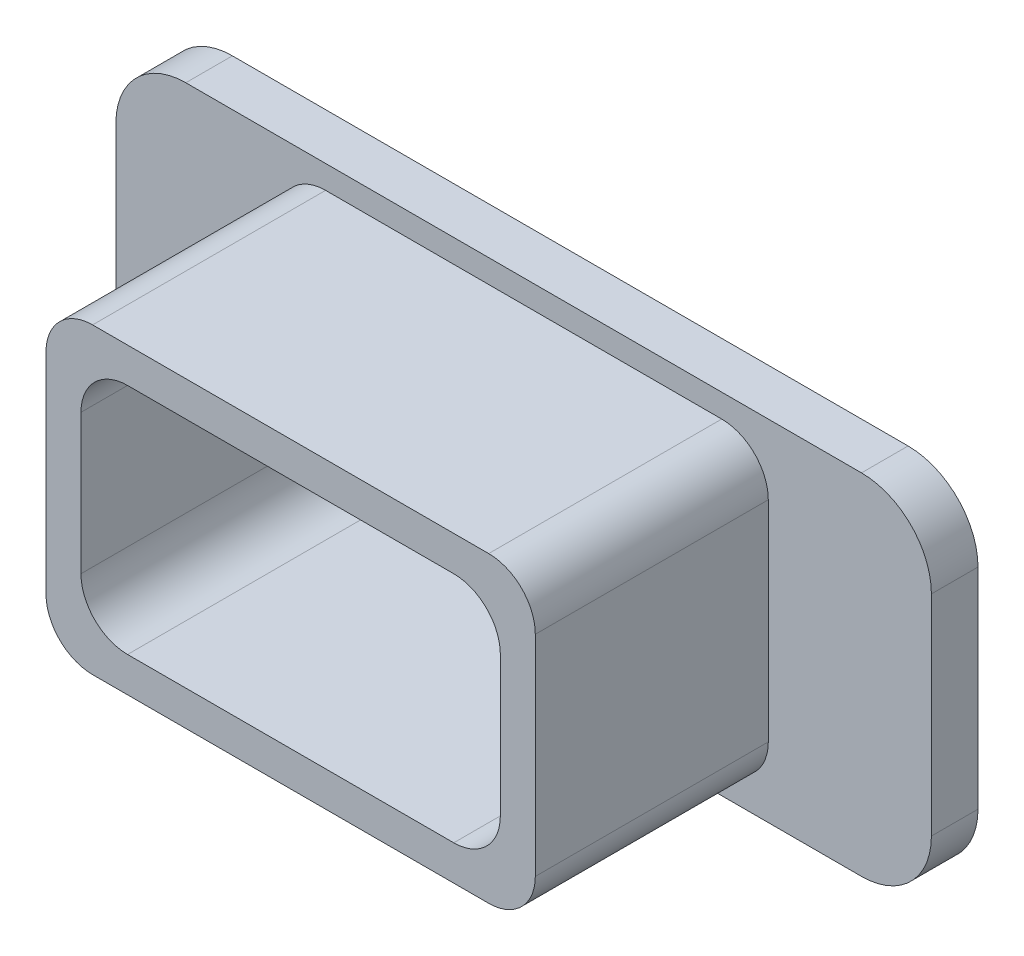
ISO-10303-21;
HEADER;
FILE_DESCRIPTION(('STEP AP214'),'2;1');
FILE_NAME('part.step','',(''),(''),'','','');
FILE_SCHEMA(('AUTOMOTIVE_DESIGN { 1 0 10303 214 1 1 1 1 }'));
ENDSEC;
DATA;
#1=APPLICATION_CONTEXT('core data for automotive mechanical design processes');
#2=APPLICATION_PROTOCOL_DEFINITION('international standard','automotive_design',2000,#1);
#3=PRODUCT_CONTEXT('',#1,'mechanical');
#4=PRODUCT('Part','Part','',(#3));
#5=PRODUCT_RELATED_PRODUCT_CATEGORY('part','',(#4));
#6=PRODUCT_DEFINITION_FORMATION('','',#4);
#7=PRODUCT_DEFINITION_CONTEXT('part definition',#1,'design');
#8=PRODUCT_DEFINITION('design','',#6,#7);
#9=PRODUCT_DEFINITION_SHAPE('','',#8);
#10=(LENGTH_UNIT() NAMED_UNIT(*) SI_UNIT(.MILLI.,.METRE.));
#11=(NAMED_UNIT(*) PLANE_ANGLE_UNIT() SI_UNIT($,.RADIAN.));
#12=(NAMED_UNIT(*) SI_UNIT($,.STERADIAN.) SOLID_ANGLE_UNIT());
#13=UNCERTAINTY_MEASURE_WITH_UNIT(LENGTH_MEASURE(1.E-05),#10,'distance_accuracy_value','');
#14=(GEOMETRIC_REPRESENTATION_CONTEXT(3) GLOBAL_UNCERTAINTY_ASSIGNED_CONTEXT((#13)) GLOBAL_UNIT_ASSIGNED_CONTEXT((#10,
#11,#12)) REPRESENTATION_CONTEXT('',''));
#15=CARTESIAN_POINT('',(0.,0.,0.));
#16=DIRECTION('',(0.,0.,1.));
#17=DIRECTION('',(1.,0.,0.));
#18=AXIS2_PLACEMENT_3D('',#15,#16,#17);
#19=CARTESIAN_POINT('',(0.,0.,2.));
#20=DIRECTION('',(0.,0.,1.));
#21=DIRECTION('',(1.,0.,0.));
#22=AXIS2_PLACEMENT_3D('',#19,#20,#21);
#23=PLANE('',#22);
#24=DIRECTION('',(0.,1.,0.));
#25=VECTOR('',#24,1.);
#26=CARTESIAN_POINT('',(17.5,7.5,2.));
#27=LINE('',#26,#25);
#28=CARTESIAN_POINT('',(17.5,-4.5,2.));
#29=VERTEX_POINT('',#28);
#30=CARTESIAN_POINT('',(17.5,4.5,2.));
#31=VERTEX_POINT('',#30);
#32=EDGE_CURVE('E245',#29,#31,#27,.T.);
#33=ORIENTED_EDGE('',*,*,#32,.T.);
#34=CARTESIAN_POINT('',(14.5,4.5,2.));
#35=DIRECTION('',(0.,0.,1.));
#36=DIRECTION('',(1.,0.,0.));
#37=AXIS2_PLACEMENT_3D('',#34,#35,#36);
#38=CIRCLE('',#37,3.);
#39=CARTESIAN_POINT('',(14.5,7.5,2.));
#40=VERTEX_POINT('',#39);
#41=EDGE_CURVE('E270',#31,#40,#38,.T.);
#42=ORIENTED_EDGE('',*,*,#41,.T.);
#43=DIRECTION('',(-1.,0.,0.));
#44=VECTOR('',#43,1.);
#45=CARTESIAN_POINT('',(-17.5,7.5,2.));
#46=LINE('',#45,#44);
#47=CARTESIAN_POINT('',(-14.5,7.5,2.));
#48=VERTEX_POINT('',#47);
#49=EDGE_CURVE('E221',#40,#48,#46,.T.);
#50=ORIENTED_EDGE('',*,*,#49,.T.);
#51=CARTESIAN_POINT('',(-14.5,4.5,2.));
#52=DIRECTION('',(0.,0.,1.));
#53=DIRECTION('',(1.,0.,0.));
#54=AXIS2_PLACEMENT_3D('',#51,#52,#53);
#55=CIRCLE('',#54,3.);
#56=CARTESIAN_POINT('',(-17.5,4.5,2.));
#57=VERTEX_POINT('',#56);
#58=EDGE_CURVE('E261',#48,#57,#55,.T.);
#59=ORIENTED_EDGE('',*,*,#58,.T.);
#60=DIRECTION('',(0.,-1.,0.));
#61=VECTOR('',#60,1.);
#62=CARTESIAN_POINT('',(-17.5,7.5,2.));
#63=LINE('',#62,#61);
#64=CARTESIAN_POINT('',(-17.5,-4.5,2.));
#65=VERTEX_POINT('',#64);
#66=EDGE_CURVE('E450',#57,#65,#63,.T.);
#67=ORIENTED_EDGE('',*,*,#66,.T.);
#68=CARTESIAN_POINT('',(-14.5,-4.5,2.));
#69=DIRECTION('',(0.,0.,1.));
#70=DIRECTION('',(1.,0.,0.));
#71=AXIS2_PLACEMENT_3D('',#68,#69,#70);
#72=CIRCLE('',#71,3.);
#73=CARTESIAN_POINT('',(-14.5,-7.5,2.));
#74=VERTEX_POINT('',#73);
#75=EDGE_CURVE('E264',#65,#74,#72,.T.);
#76=ORIENTED_EDGE('',*,*,#75,.T.);
#77=DIRECTION('',(1.,0.,0.));
#78=VECTOR('',#77,1.);
#79=CARTESIAN_POINT('',(-17.5,-7.5,2.));
#80=LINE('',#79,#78);
#81=CARTESIAN_POINT('',(14.5,-7.5,2.));
#82=VERTEX_POINT('',#81);
#83=EDGE_CURVE('E247',#74,#82,#80,.T.);
#84=ORIENTED_EDGE('',*,*,#83,.T.);
#85=CARTESIAN_POINT('',(14.5,-4.5,2.));
#86=DIRECTION('',(0.,0.,1.));
#87=DIRECTION('',(1.,0.,0.));
#88=AXIS2_PLACEMENT_3D('',#85,#86,#87);
#89=CIRCLE('',#88,3.);
#90=EDGE_CURVE('E267',#82,#29,#89,.T.);
#91=ORIENTED_EDGE('',*,*,#90,.T.);
#92=EDGE_LOOP('',(#33,#42,#50,#59,#67,#76,#84,#91));
#93=FACE_BOUND('',#92,.T.);
#94=DIRECTION('',(-1.,0.,0.));
#95=VECTOR('',#94,1.);
#96=CARTESIAN_POINT('',(-10.5,6.5,2.));
#97=LINE('',#96,#95);
#98=CARTESIAN_POINT('',(8.49999999999999,6.5,2.));
#99=VERTEX_POINT('',#98);
#100=CARTESIAN_POINT('',(-8.5,6.5,2.));
#101=VERTEX_POINT('',#100);
#102=EDGE_CURVE('E386',#99,#101,#97,.T.);
#103=ORIENTED_EDGE('',*,*,#102,.F.);
#104=CARTESIAN_POINT('',(8.5,4.5,2.));
#105=DIRECTION('',(0.,0.,1.));
#106=DIRECTION('',(1.,0.,0.));
#107=AXIS2_PLACEMENT_3D('',#104,#105,#106);
#108=CIRCLE('',#107,2.);
#109=CARTESIAN_POINT('',(10.5,4.5,2.));
#110=VERTEX_POINT('',#109);
#111=EDGE_CURVE('E381',#99,#110,#108,.F.);
#112=ORIENTED_EDGE('',*,*,#111,.T.);
#113=DIRECTION('',(0.,1.,0.));
#114=VECTOR('',#113,1.);
#115=CARTESIAN_POINT('',(10.5,6.5,2.));
#116=LINE('',#115,#114);
#117=CARTESIAN_POINT('',(10.5,-4.5,2.));
#118=VERTEX_POINT('',#117);
#119=EDGE_CURVE('E394',#118,#110,#116,.T.);
#120=ORIENTED_EDGE('',*,*,#119,.F.);
#121=CARTESIAN_POINT('',(8.5,-4.5,2.));
#122=DIRECTION('',(0.,0.,1.));
#123=DIRECTION('',(1.,0.,0.));
#124=AXIS2_PLACEMENT_3D('',#121,#122,#123);
#125=CIRCLE('',#124,2.);
#126=CARTESIAN_POINT('',(8.49999999999999,-6.5,2.));
#127=VERTEX_POINT('',#126);
#128=EDGE_CURVE('E378',#118,#127,#125,.F.);
#129=ORIENTED_EDGE('',*,*,#128,.T.);
#130=DIRECTION('',(1.,0.,0.));
#131=VECTOR('',#130,1.);
#132=CARTESIAN_POINT('',(-10.5,-6.5,2.));
#133=LINE('',#132,#131);
#134=CARTESIAN_POINT('',(-8.5,-6.5,2.));
#135=VERTEX_POINT('',#134);
#136=EDGE_CURVE('E427',#135,#127,#133,.T.);
#137=ORIENTED_EDGE('',*,*,#136,.F.);
#138=CARTESIAN_POINT('',(-8.5,-4.5,2.));
#139=DIRECTION('',(0.,0.,1.));
#140=DIRECTION('',(1.,0.,0.));
#141=AXIS2_PLACEMENT_3D('',#138,#139,#140);
#142=CIRCLE('',#141,2.);
#143=CARTESIAN_POINT('',(-10.5,-4.5,2.));
#144=VERTEX_POINT('',#143);
#145=EDGE_CURVE('E11',#135,#144,#142,.F.);
#146=ORIENTED_EDGE('',*,*,#145,.T.);
#147=DIRECTION('',(0.,-1.,0.));
#148=VECTOR('',#147,1.);
#149=CARTESIAN_POINT('',(-10.5,6.5,2.));
#150=LINE('',#149,#148);
#151=CARTESIAN_POINT('',(-10.5,4.5,2.));
#152=VERTEX_POINT('',#151);
#153=EDGE_CURVE('E387',#152,#144,#150,.T.);
#154=ORIENTED_EDGE('',*,*,#153,.F.);
#155=CARTESIAN_POINT('',(-8.5,4.5,2.));
#156=DIRECTION('',(0.,0.,1.));
#157=DIRECTION('',(1.,0.,0.));
#158=AXIS2_PLACEMENT_3D('',#155,#156,#157);
#159=CIRCLE('',#158,2.);
#160=EDGE_CURVE('E48',#152,#101,#159,.F.);
#161=ORIENTED_EDGE('',*,*,#160,.T.);
#162=EDGE_LOOP('',(#103,#112,#120,#129,#137,#146,#154,#161));
#163=FACE_BOUND('',#162,.T.);
#164=ADVANCED_FACE('F39',(#93,#163),#23,.T.);
#165=CARTESIAN_POINT('',(0.,0.,0.));
#166=DIRECTION('',(0.,0.,1.));
#167=DIRECTION('',(1.,0.,0.));
#168=AXIS2_PLACEMENT_3D('',#165,#166,#167);
#169=PLANE('',#168);
#170=DIRECTION('',(-1.,0.,0.));
#171=VECTOR('',#170,1.);
#172=CARTESIAN_POINT('',(-17.5,7.5,0.));
#173=LINE('',#172,#171);
#174=CARTESIAN_POINT('',(14.5,7.5,0.));
#175=VERTEX_POINT('',#174);
#176=CARTESIAN_POINT('',(-14.5,7.5,0.));
#177=VERTEX_POINT('',#176);
#178=EDGE_CURVE('E218',#175,#177,#173,.T.);
#179=ORIENTED_EDGE('',*,*,#178,.F.);
#180=CARTESIAN_POINT('',(14.5,4.5,0.));
#181=DIRECTION('',(0.,0.,1.));
#182=DIRECTION('',(1.,0.,0.));
#183=AXIS2_PLACEMENT_3D('',#180,#181,#182);
#184=CIRCLE('',#183,3.);
#185=CARTESIAN_POINT('',(17.5,4.5,0.));
#186=VERTEX_POINT('',#185);
#187=EDGE_CURVE('E200',#175,#186,#184,.F.);
#188=ORIENTED_EDGE('',*,*,#187,.T.);
#189=DIRECTION('',(0.,1.,0.));
#190=VECTOR('',#189,1.);
#191=CARTESIAN_POINT('',(17.5,7.5,0.));
#192=LINE('',#191,#190);
#193=CARTESIAN_POINT('',(17.5,-4.5,0.));
#194=VERTEX_POINT('',#193);
#195=EDGE_CURVE('E231',#194,#186,#192,.T.);
#196=ORIENTED_EDGE('',*,*,#195,.F.);
#197=CARTESIAN_POINT('',(14.5,-4.5,0.));
#198=DIRECTION('',(0.,0.,1.));
#199=DIRECTION('',(1.,0.,0.));
#200=AXIS2_PLACEMENT_3D('',#197,#198,#199);
#201=CIRCLE('',#200,3.);
#202=CARTESIAN_POINT('',(14.5,-7.5,0.));
#203=VERTEX_POINT('',#202);
#204=EDGE_CURVE('E212',#194,#203,#201,.F.);
#205=ORIENTED_EDGE('',*,*,#204,.T.);
#206=DIRECTION('',(1.,0.,0.));
#207=VECTOR('',#206,1.);
#208=CARTESIAN_POINT('',(-17.5,-7.5,0.));
#209=LINE('',#208,#207);
#210=CARTESIAN_POINT('',(-14.5,-7.5,0.));
#211=VERTEX_POINT('',#210);
#212=EDGE_CURVE('E236',#211,#203,#209,.T.);
#213=ORIENTED_EDGE('',*,*,#212,.F.);
#214=CARTESIAN_POINT('',(-14.5,-4.5,0.));
#215=DIRECTION('',(0.,0.,1.));
#216=DIRECTION('',(1.,0.,0.));
#217=AXIS2_PLACEMENT_3D('',#214,#215,#216);
#218=CIRCLE('',#217,3.);
#219=CARTESIAN_POINT('',(-17.5,-4.5,0.));
#220=VERTEX_POINT('',#219);
#221=EDGE_CURVE('E251',#211,#220,#218,.F.);
#222=ORIENTED_EDGE('',*,*,#221,.T.);
#223=DIRECTION('',(0.,-1.,0.));
#224=VECTOR('',#223,1.);
#225=CARTESIAN_POINT('',(-17.5,7.5,0.));
#226=LINE('',#225,#224);
#227=CARTESIAN_POINT('',(-17.5,4.5,0.));
#228=VERTEX_POINT('',#227);
#229=EDGE_CURVE('E230',#228,#220,#226,.T.);
#230=ORIENTED_EDGE('',*,*,#229,.F.);
#231=CARTESIAN_POINT('',(-14.5,4.5,0.));
#232=DIRECTION('',(0.,0.,1.));
#233=DIRECTION('',(1.,0.,0.));
#234=AXIS2_PLACEMENT_3D('',#231,#232,#233);
#235=CIRCLE('',#234,3.);
#236=EDGE_CURVE('E223',#228,#177,#235,.F.);
#237=ORIENTED_EDGE('',*,*,#236,.T.);
#238=EDGE_LOOP('',(#179,#188,#196,#205,#213,#222,#230,#237));
#239=FACE_BOUND('',#238,.T.);
#240=DIRECTION('',(1.,0.,0.));
#241=VECTOR('',#240,1.);
#242=CARTESIAN_POINT('',(-9.,-5.,0.));
#243=LINE('',#242,#241);
#244=CARTESIAN_POINT('',(-7.,-5.,0.));
#245=VERTEX_POINT('',#244);
#246=CARTESIAN_POINT('',(7.,-5.,0.));
#247=VERTEX_POINT('',#246);
#248=EDGE_CURVE('E238',#245,#247,#243,.T.);
#249=ORIENTED_EDGE('',*,*,#248,.T.);
#250=CARTESIAN_POINT('',(7.,-3.,0.));
#251=DIRECTION('',(0.,0.,1.));
#252=DIRECTION('',(1.,0.,0.));
#253=AXIS2_PLACEMENT_3D('',#250,#251,#252);
#254=CIRCLE('',#253,2.);
#255=CARTESIAN_POINT('',(9.,-3.,0.));
#256=VERTEX_POINT('',#255);
#257=EDGE_CURVE('E333',#247,#256,#254,.T.);
#258=ORIENTED_EDGE('',*,*,#257,.T.);
#259=DIRECTION('',(0.,1.,0.));
#260=VECTOR('',#259,1.);
#261=CARTESIAN_POINT('',(9.,5.,0.));
#262=LINE('',#261,#260);
#263=CARTESIAN_POINT('',(9.,3.,0.));
#264=VERTEX_POINT('',#263);
#265=EDGE_CURVE('E415',#256,#264,#262,.T.);
#266=ORIENTED_EDGE('',*,*,#265,.T.);
#267=CARTESIAN_POINT('',(7.,3.,0.));
#268=DIRECTION('',(0.,0.,1.));
#269=DIRECTION('',(1.,0.,0.));
#270=AXIS2_PLACEMENT_3D('',#267,#268,#269);
#271=CIRCLE('',#270,2.);
#272=CARTESIAN_POINT('',(7.,5.,0.));
#273=VERTEX_POINT('',#272);
#274=EDGE_CURVE('E321',#264,#273,#271,.T.);
#275=ORIENTED_EDGE('',*,*,#274,.T.);
#276=DIRECTION('',(-1.,0.,0.));
#277=VECTOR('',#276,1.);
#278=CARTESIAN_POINT('',(-9.,5.,0.));
#279=LINE('',#278,#277);
#280=CARTESIAN_POINT('',(-7.,5.,0.));
#281=VERTEX_POINT('',#280);
#282=EDGE_CURVE('E434',#273,#281,#279,.T.);
#283=ORIENTED_EDGE('',*,*,#282,.T.);
#284=CARTESIAN_POINT('',(-7.,3.,0.));
#285=DIRECTION('',(0.,0.,1.));
#286=DIRECTION('',(1.,0.,0.));
#287=AXIS2_PLACEMENT_3D('',#284,#285,#286);
#288=CIRCLE('',#287,2.);
#289=CARTESIAN_POINT('',(-9.,3.,0.));
#290=VERTEX_POINT('',#289);
#291=EDGE_CURVE('E315',#281,#290,#288,.T.);
#292=ORIENTED_EDGE('',*,*,#291,.T.);
#293=DIRECTION('',(0.,-1.,0.));
#294=VECTOR('',#293,1.);
#295=CARTESIAN_POINT('',(-9.,5.,0.));
#296=LINE('',#295,#294);
#297=CARTESIAN_POINT('',(-9.,-3.,0.));
#298=VERTEX_POINT('',#297);
#299=EDGE_CURVE('E438',#290,#298,#296,.T.);
#300=ORIENTED_EDGE('',*,*,#299,.T.);
#301=CARTESIAN_POINT('',(-7.,-3.,0.));
#302=DIRECTION('',(0.,0.,1.));
#303=DIRECTION('',(1.,0.,0.));
#304=AXIS2_PLACEMENT_3D('',#301,#302,#303);
#305=CIRCLE('',#304,2.);
#306=EDGE_CURVE('E327',#298,#245,#305,.T.);
#307=ORIENTED_EDGE('',*,*,#306,.T.);
#308=EDGE_LOOP('',(#249,#258,#266,#275,#283,#292,#300,#307));
#309=FACE_BOUND('',#308,.T.);
#310=ADVANCED_FACE('F226',(#239,#309),#169,.F.);
#311=CARTESIAN_POINT('',(17.5,7.5,2.));
#312=DIRECTION('',(-1.,0.,0.));
#313=DIRECTION('',(0.,0.,1.));
#314=AXIS2_PLACEMENT_3D('',#311,#312,#313);
#315=PLANE('',#314);
#316=ORIENTED_EDGE('',*,*,#195,.T.);
#317=DIRECTION('',(0.,0.,-1.));
#318=VECTOR('',#317,1.);
#319=CARTESIAN_POINT('',(17.5,4.5,2.));
#320=LINE('',#319,#318);
#321=EDGE_CURVE('E205',#186,#31,#320,.F.);
#322=ORIENTED_EDGE('',*,*,#321,.T.);
#323=ORIENTED_EDGE('',*,*,#32,.F.);
#324=DIRECTION('',(0.,0.,-1.));
#325=VECTOR('',#324,1.);
#326=CARTESIAN_POINT('',(17.5,-4.5,2.));
#327=LINE('',#326,#325);
#328=EDGE_CURVE('E211',#29,#194,#327,.T.);
#329=ORIENTED_EDGE('',*,*,#328,.T.);
#330=EDGE_LOOP('',(#316,#322,#323,#329));
#331=FACE_BOUND('',#330,.T.);
#332=ADVANCED_FACE('F467',(#331),#315,.F.);
#333=CARTESIAN_POINT('',(-17.5,7.5,2.));
#334=DIRECTION('',(0.,-1.,0.));
#335=DIRECTION('',(0.,0.,-1.));
#336=AXIS2_PLACEMENT_3D('',#333,#334,#335);
#337=PLANE('',#336);
#338=ORIENTED_EDGE('',*,*,#49,.F.);
#339=DIRECTION('',(0.,0.,-1.));
#340=VECTOR('',#339,1.);
#341=CARTESIAN_POINT('',(14.5,7.5,2.));
#342=LINE('',#341,#340);
#343=EDGE_CURVE('E204',#40,#175,#342,.T.);
#344=ORIENTED_EDGE('',*,*,#343,.T.);
#345=ORIENTED_EDGE('',*,*,#178,.T.);
#346=DIRECTION('',(0.,0.,-1.));
#347=VECTOR('',#346,1.);
#348=CARTESIAN_POINT('',(-14.5,7.5,2.));
#349=LINE('',#348,#347);
#350=EDGE_CURVE('E224',#177,#48,#349,.F.);
#351=ORIENTED_EDGE('',*,*,#350,.T.);
#352=EDGE_LOOP('',(#338,#344,#345,#351));
#353=FACE_BOUND('',#352,.T.);
#354=ADVANCED_FACE('F217',(#353),#337,.F.);
#355=CARTESIAN_POINT('',(-17.5,7.5,2.));
#356=DIRECTION('',(1.,0.,0.));
#357=DIRECTION('',(0.,0.,-1.));
#358=AXIS2_PLACEMENT_3D('',#355,#356,#357);
#359=PLANE('',#358);
#360=ORIENTED_EDGE('',*,*,#229,.T.);
#361=DIRECTION('',(0.,0.,-1.));
#362=VECTOR('',#361,1.);
#363=CARTESIAN_POINT('',(-17.5,-4.5,2.));
#364=LINE('',#363,#362);
#365=EDGE_CURVE('E284',#220,#65,#364,.F.);
#366=ORIENTED_EDGE('',*,*,#365,.T.);
#367=ORIENTED_EDGE('',*,*,#66,.F.);
#368=DIRECTION('',(0.,0.,-1.));
#369=VECTOR('',#368,1.);
#370=CARTESIAN_POINT('',(-17.5,4.5,2.));
#371=LINE('',#370,#369);
#372=EDGE_CURVE('E280',#57,#228,#371,.T.);
#373=ORIENTED_EDGE('',*,*,#372,.T.);
#374=EDGE_LOOP('',(#360,#366,#367,#373));
#375=FACE_BOUND('',#374,.T.);
#376=ADVANCED_FACE('F474',(#375),#359,.F.);
#377=CARTESIAN_POINT('',(-17.5,-7.5,2.));
#378=DIRECTION('',(0.,1.,0.));
#379=DIRECTION('',(0.,0.,1.));
#380=AXIS2_PLACEMENT_3D('',#377,#378,#379);
#381=PLANE('',#380);
#382=ORIENTED_EDGE('',*,*,#212,.T.);
#383=DIRECTION('',(0.,0.,-1.));
#384=VECTOR('',#383,1.);
#385=CARTESIAN_POINT('',(14.5,-7.5,2.));
#386=LINE('',#385,#384);
#387=EDGE_CURVE('E277',#203,#82,#386,.F.);
#388=ORIENTED_EDGE('',*,*,#387,.T.);
#389=ORIENTED_EDGE('',*,*,#83,.F.);
#390=DIRECTION('',(0.,0.,-1.));
#391=VECTOR('',#390,1.);
#392=CARTESIAN_POINT('',(-14.5,-7.5,2.));
#393=LINE('',#392,#391);
#394=EDGE_CURVE('E273',#74,#211,#393,.T.);
#395=ORIENTED_EDGE('',*,*,#394,.T.);
#396=EDGE_LOOP('',(#382,#388,#389,#395));
#397=FACE_BOUND('',#396,.T.);
#398=ADVANCED_FACE('F469',(#397),#381,.F.);
#399=CARTESIAN_POINT('',(9.,5.,2.));
#400=DIRECTION('',(-1.,0.,0.));
#401=DIRECTION('',(0.,0.,1.));
#402=AXIS2_PLACEMENT_3D('',#399,#400,#401);
#403=PLANE('',#402);
#404=DIRECTION('',(0.,1.,0.));
#405=VECTOR('',#404,1.);
#406=CARTESIAN_POINT('',(9.,5.,12.));
#407=LINE('',#406,#405);
#408=CARTESIAN_POINT('',(9.,-3.,12.));
#409=VERTEX_POINT('',#408);
#410=CARTESIAN_POINT('',(9.,3.,12.));
#411=VERTEX_POINT('',#410);
#412=EDGE_CURVE('E718',#409,#411,#407,.T.);
#413=ORIENTED_EDGE('',*,*,#412,.T.);
#414=DIRECTION('',(0.,0.,-1.));
#415=VECTOR('',#414,1.);
#416=CARTESIAN_POINT('',(9.,3.,0.));
#417=LINE('',#416,#415);
#418=EDGE_CURVE('E304',#411,#264,#417,.T.);
#419=ORIENTED_EDGE('',*,*,#418,.T.);
#420=ORIENTED_EDGE('',*,*,#265,.F.);
#421=DIRECTION('',(0.,0.,-1.));
#422=VECTOR('',#421,1.);
#423=CARTESIAN_POINT('',(9.,-3.,12.));
#424=LINE('',#423,#422);
#425=EDGE_CURVE('E301',#256,#409,#424,.F.);
#426=ORIENTED_EDGE('',*,*,#425,.T.);
#427=EDGE_LOOP('',(#413,#419,#420,#426));
#428=FACE_BOUND('',#427,.T.);
#429=ADVANCED_FACE('F498',(#428),#403,.T.);
#430=CARTESIAN_POINT('',(-9.,5.,2.));
#431=DIRECTION('',(0.,-1.,0.));
#432=DIRECTION('',(0.,0.,-1.));
#433=AXIS2_PLACEMENT_3D('',#430,#431,#432);
#434=PLANE('',#433);
#435=DIRECTION('',(-1.,0.,0.));
#436=VECTOR('',#435,1.);
#437=CARTESIAN_POINT('',(-9.,5.,12.));
#438=LINE('',#437,#436);
#439=CARTESIAN_POINT('',(7.,5.,12.));
#440=VERTEX_POINT('',#439);
#441=CARTESIAN_POINT('',(-7.,5.,12.));
#442=VERTEX_POINT('',#441);
#443=EDGE_CURVE('E714',#440,#442,#438,.T.);
#444=ORIENTED_EDGE('',*,*,#443,.T.);
#445=DIRECTION('',(0.,0.,-1.));
#446=VECTOR('',#445,1.);
#447=CARTESIAN_POINT('',(-7.,5.,0.));
#448=LINE('',#447,#446);
#449=EDGE_CURVE('E290',#442,#281,#448,.T.);
#450=ORIENTED_EDGE('',*,*,#449,.T.);
#451=ORIENTED_EDGE('',*,*,#282,.F.);
#452=DIRECTION('',(0.,0.,-1.));
#453=VECTOR('',#452,1.);
#454=CARTESIAN_POINT('',(7.,5.,12.));
#455=LINE('',#454,#453);
#456=EDGE_CURVE('E287',#273,#440,#455,.F.);
#457=ORIENTED_EDGE('',*,*,#456,.T.);
#458=EDGE_LOOP('',(#444,#450,#451,#457));
#459=FACE_BOUND('',#458,.T.);
#460=ADVANCED_FACE('F543',(#459),#434,.T.);
#461=CARTESIAN_POINT('',(-9.,5.,2.));
#462=DIRECTION('',(1.,0.,0.));
#463=DIRECTION('',(0.,0.,-1.));
#464=AXIS2_PLACEMENT_3D('',#461,#462,#463);
#465=PLANE('',#464);
#466=ORIENTED_EDGE('',*,*,#299,.F.);
#467=DIRECTION('',(0.,0.,-1.));
#468=VECTOR('',#467,1.);
#469=CARTESIAN_POINT('',(-9.,3.,12.));
#470=LINE('',#469,#468);
#471=CARTESIAN_POINT('',(-9.,3.,12.));
#472=VERTEX_POINT('',#471);
#473=EDGE_CURVE('E298',#290,#472,#470,.F.);
#474=ORIENTED_EDGE('',*,*,#473,.T.);
#475=DIRECTION('',(0.,-1.,0.));
#476=VECTOR('',#475,1.);
#477=CARTESIAN_POINT('',(-9.,5.,12.));
#478=LINE('',#477,#476);
#479=CARTESIAN_POINT('',(-9.,-3.,12.));
#480=VERTEX_POINT('',#479);
#481=EDGE_CURVE('E710',#472,#480,#478,.T.);
#482=ORIENTED_EDGE('',*,*,#481,.T.);
#483=DIRECTION('',(0.,0.,-1.));
#484=VECTOR('',#483,1.);
#485=CARTESIAN_POINT('',(-9.,-3.,0.));
#486=LINE('',#485,#484);
#487=EDGE_CURVE('E294',#480,#298,#486,.T.);
#488=ORIENTED_EDGE('',*,*,#487,.T.);
#489=EDGE_LOOP('',(#466,#474,#482,#488));
#490=FACE_BOUND('',#489,.T.);
#491=ADVANCED_FACE('F554',(#490),#465,.T.);
#492=CARTESIAN_POINT('',(-9.,-5.,2.));
#493=DIRECTION('',(0.,1.,0.));
#494=DIRECTION('',(0.,0.,1.));
#495=AXIS2_PLACEMENT_3D('',#492,#493,#494);
#496=PLANE('',#495);
#497=ORIENTED_EDGE('',*,*,#248,.F.);
#498=DIRECTION('',(0.,0.,-1.));
#499=VECTOR('',#498,1.);
#500=CARTESIAN_POINT('',(-7.,-5.,12.));
#501=LINE('',#500,#499);
#502=CARTESIAN_POINT('',(-7.,-5.,12.));
#503=VERTEX_POINT('',#502);
#504=EDGE_CURVE('E312',#245,#503,#501,.F.);
#505=ORIENTED_EDGE('',*,*,#504,.T.);
#506=DIRECTION('',(1.,0.,0.));
#507=VECTOR('',#506,1.);
#508=CARTESIAN_POINT('',(-9.,-5.,12.));
#509=LINE('',#508,#507);
#510=CARTESIAN_POINT('',(7.,-5.,12.));
#511=VERTEX_POINT('',#510);
#512=EDGE_CURVE('E423',#503,#511,#509,.T.);
#513=ORIENTED_EDGE('',*,*,#512,.T.);
#514=DIRECTION('',(0.,0.,-1.));
#515=VECTOR('',#514,1.);
#516=CARTESIAN_POINT('',(7.,-5.,0.));
#517=LINE('',#516,#515);
#518=EDGE_CURVE('E308',#511,#247,#517,.T.);
#519=ORIENTED_EDGE('',*,*,#518,.T.);
#520=EDGE_LOOP('',(#497,#505,#513,#519));
#521=FACE_BOUND('',#520,.T.);
#522=ADVANCED_FACE('F564',(#521),#496,.T.);
#523=CARTESIAN_POINT('',(0.,0.,12.));
#524=DIRECTION('',(0.,0.,1.));
#525=DIRECTION('',(1.,0.,0.));
#526=AXIS2_PLACEMENT_3D('',#523,#524,#525);
#527=PLANE('',#526);
#528=DIRECTION('',(1.,0.,0.));
#529=VECTOR('',#528,1.);
#530=CARTESIAN_POINT('',(-10.5,-6.5,12.));
#531=LINE('',#530,#529);
#532=CARTESIAN_POINT('',(-8.5,-6.5,12.));
#533=VERTEX_POINT('',#532);
#534=CARTESIAN_POINT('',(8.49999999999999,-6.5,12.));
#535=VERTEX_POINT('',#534);
#536=EDGE_CURVE('E411',#533,#535,#531,.T.);
#537=ORIENTED_EDGE('',*,*,#536,.T.);
#538=CARTESIAN_POINT('',(8.5,-4.5,12.));
#539=DIRECTION('',(0.,0.,1.));
#540=DIRECTION('',(1.,0.,0.));
#541=AXIS2_PLACEMENT_3D('',#538,#539,#540);
#542=CIRCLE('',#541,2.);
#543=CARTESIAN_POINT('',(10.5,-4.5,12.));
#544=VERTEX_POINT('',#543);
#545=EDGE_CURVE('E362',#535,#544,#542,.T.);
#546=ORIENTED_EDGE('',*,*,#545,.T.);
#547=DIRECTION('',(0.,1.,0.));
#548=VECTOR('',#547,1.);
#549=CARTESIAN_POINT('',(10.5,6.5,12.));
#550=LINE('',#549,#548);
#551=CARTESIAN_POINT('',(10.5,4.5,12.));
#552=VERTEX_POINT('',#551);
#553=EDGE_CURVE('E417',#544,#552,#550,.T.);
#554=ORIENTED_EDGE('',*,*,#553,.T.);
#555=CARTESIAN_POINT('',(8.5,4.5,12.));
#556=DIRECTION('',(0.,0.,1.));
#557=DIRECTION('',(1.,0.,0.));
#558=AXIS2_PLACEMENT_3D('',#555,#556,#557);
#559=CIRCLE('',#558,2.);
#560=CARTESIAN_POINT('',(8.49999999999999,6.5,12.));
#561=VERTEX_POINT('',#560);
#562=EDGE_CURVE('E359',#552,#561,#559,.T.);
#563=ORIENTED_EDGE('',*,*,#562,.T.);
#564=DIRECTION('',(-1.,0.,0.));
#565=VECTOR('',#564,1.);
#566=CARTESIAN_POINT('',(-10.5,6.5,12.));
#567=LINE('',#566,#565);
#568=CARTESIAN_POINT('',(-8.5,6.5,12.));
#569=VERTEX_POINT('',#568);
#570=EDGE_CURVE('E406',#561,#569,#567,.T.);
#571=ORIENTED_EDGE('',*,*,#570,.T.);
#572=CARTESIAN_POINT('',(-8.5,4.5,12.));
#573=DIRECTION('',(0.,0.,1.));
#574=DIRECTION('',(1.,0.,0.));
#575=AXIS2_PLACEMENT_3D('',#572,#573,#574);
#576=CIRCLE('',#575,2.);
#577=CARTESIAN_POINT('',(-10.5,4.5,12.));
#578=VERTEX_POINT('',#577);
#579=EDGE_CURVE('E356',#569,#578,#576,.T.);
#580=ORIENTED_EDGE('',*,*,#579,.T.);
#581=DIRECTION('',(0.,-1.,0.));
#582=VECTOR('',#581,1.);
#583=CARTESIAN_POINT('',(-10.5,6.5,12.));
#584=LINE('',#583,#582);
#585=CARTESIAN_POINT('',(-10.5,-4.5,12.));
#586=VERTEX_POINT('',#585);
#587=EDGE_CURVE('E404',#578,#586,#584,.T.);
#588=ORIENTED_EDGE('',*,*,#587,.T.);
#589=CARTESIAN_POINT('',(-8.5,-4.5,12.));
#590=DIRECTION('',(0.,0.,1.));
#591=DIRECTION('',(1.,0.,0.));
#592=AXIS2_PLACEMENT_3D('',#589,#590,#591);
#593=CIRCLE('',#592,2.);
#594=EDGE_CURVE('E353',#586,#533,#593,.T.);
#595=ORIENTED_EDGE('',*,*,#594,.T.);
#596=EDGE_LOOP('',(#537,#546,#554,#563,#571,#580,#588,#595));
#597=FACE_BOUND('',#596,.T.);
#598=ORIENTED_EDGE('',*,*,#443,.F.);
#599=CARTESIAN_POINT('',(7.,3.,12.));
#600=DIRECTION('',(0.,0.,1.));
#601=DIRECTION('',(1.,0.,0.));
#602=AXIS2_PLACEMENT_3D('',#599,#600,#601);
#603=CIRCLE('',#602,2.);
#604=EDGE_CURVE('E324',#440,#411,#603,.F.);
#605=ORIENTED_EDGE('',*,*,#604,.T.);
#606=ORIENTED_EDGE('',*,*,#412,.F.);
#607=CARTESIAN_POINT('',(7.,-3.,12.));
#608=DIRECTION('',(0.,0.,1.));
#609=DIRECTION('',(1.,0.,0.));
#610=AXIS2_PLACEMENT_3D('',#607,#608,#609);
#611=CIRCLE('',#610,2.);
#612=EDGE_CURVE('E336',#409,#511,#611,.F.);
#613=ORIENTED_EDGE('',*,*,#612,.T.);
#614=ORIENTED_EDGE('',*,*,#512,.F.);
#615=CARTESIAN_POINT('',(-7.,-3.,12.));
#616=DIRECTION('',(0.,0.,1.));
#617=DIRECTION('',(1.,0.,0.));
#618=AXIS2_PLACEMENT_3D('',#615,#616,#617);
#619=CIRCLE('',#618,2.);
#620=EDGE_CURVE('E330',#503,#480,#619,.F.);
#621=ORIENTED_EDGE('',*,*,#620,.T.);
#622=ORIENTED_EDGE('',*,*,#481,.F.);
#623=CARTESIAN_POINT('',(-7.,3.,12.));
#624=DIRECTION('',(0.,0.,1.));
#625=DIRECTION('',(1.,0.,0.));
#626=AXIS2_PLACEMENT_3D('',#623,#624,#625);
#627=CIRCLE('',#626,2.);
#628=EDGE_CURVE('E318',#472,#442,#627,.F.);
#629=ORIENTED_EDGE('',*,*,#628,.T.);
#630=EDGE_LOOP('',(#598,#605,#606,#613,#614,#621,#622,#629));
#631=FACE_BOUND('',#630,.T.);
#632=ADVANCED_FACE('F402',(#597,#631),#527,.T.);
#633=CARTESIAN_POINT('',(10.5,6.5,12.));
#634=DIRECTION('',(-1.,0.,0.));
#635=DIRECTION('',(0.,0.,1.));
#636=AXIS2_PLACEMENT_3D('',#633,#634,#635);
#637=PLANE('',#636);
#638=ORIENTED_EDGE('',*,*,#553,.F.);
#639=DIRECTION('',(0.,0.,-1.));
#640=VECTOR('',#639,1.);
#641=CARTESIAN_POINT('',(10.5,-4.5,12.));
#642=LINE('',#641,#640);
#643=EDGE_CURVE('E342',#544,#118,#642,.T.);
#644=ORIENTED_EDGE('',*,*,#643,.T.);
#645=ORIENTED_EDGE('',*,*,#119,.T.);
#646=DIRECTION('',(0.,0.,-1.));
#647=VECTOR('',#646,1.);
#648=CARTESIAN_POINT('',(10.5,4.5,12.));
#649=LINE('',#648,#647);
#650=EDGE_CURVE('E339',#110,#552,#649,.F.);
#651=ORIENTED_EDGE('',*,*,#650,.T.);
#652=EDGE_LOOP('',(#638,#644,#645,#651));
#653=FACE_BOUND('',#652,.T.);
#654=ADVANCED_FACE('F625',(#653),#637,.F.);
#655=CARTESIAN_POINT('',(-10.5,6.5,12.));
#656=DIRECTION('',(0.,-1.,0.));
#657=DIRECTION('',(0.,0.,-1.));
#658=AXIS2_PLACEMENT_3D('',#655,#656,#657);
#659=PLANE('',#658);
#660=ORIENTED_EDGE('',*,*,#570,.F.);
#661=DIRECTION('',(0.,0.,-1.));
#662=VECTOR('',#661,1.);
#663=CARTESIAN_POINT('',(8.5,6.5,12.));
#664=LINE('',#663,#662);
#665=EDGE_CURVE('E368',#561,#99,#664,.T.);
#666=ORIENTED_EDGE('',*,*,#665,.T.);
#667=ORIENTED_EDGE('',*,*,#102,.T.);
#668=DIRECTION('',(0.,0.,-1.));
#669=VECTOR('',#668,1.);
#670=CARTESIAN_POINT('',(-8.5,6.5,12.));
#671=LINE('',#670,#669);
#672=EDGE_CURVE('E365',#101,#569,#671,.F.);
#673=ORIENTED_EDGE('',*,*,#672,.T.);
#674=EDGE_LOOP('',(#660,#666,#667,#673));
#675=FACE_BOUND('',#674,.T.);
#676=ADVANCED_FACE('F390',(#675),#659,.F.);
#677=CARTESIAN_POINT('',(-10.5,6.5,12.));
#678=DIRECTION('',(1.,0.,0.));
#679=DIRECTION('',(0.,0.,-1.));
#680=AXIS2_PLACEMENT_3D('',#677,#678,#679);
#681=PLANE('',#680);
#682=ORIENTED_EDGE('',*,*,#587,.F.);
#683=DIRECTION('',(0.,0.,-1.));
#684=VECTOR('',#683,1.);
#685=CARTESIAN_POINT('',(-10.5,4.5,12.));
#686=LINE('',#685,#684);
#687=EDGE_CURVE('E375',#578,#152,#686,.T.);
#688=ORIENTED_EDGE('',*,*,#687,.T.);
#689=ORIENTED_EDGE('',*,*,#153,.T.);
#690=DIRECTION('',(0.,0.,-1.));
#691=VECTOR('',#690,1.);
#692=CARTESIAN_POINT('',(-10.5,-4.5,12.));
#693=LINE('',#692,#691);
#694=EDGE_CURVE('E372',#144,#586,#693,.F.);
#695=ORIENTED_EDGE('',*,*,#694,.T.);
#696=EDGE_LOOP('',(#682,#688,#689,#695));
#697=FACE_BOUND('',#696,.T.);
#698=ADVANCED_FACE('F408',(#697),#681,.F.);
#699=CARTESIAN_POINT('',(-10.5,-6.5,12.));
#700=DIRECTION('',(0.,1.,0.));
#701=DIRECTION('',(0.,0.,1.));
#702=AXIS2_PLACEMENT_3D('',#699,#700,#701);
#703=PLANE('',#702);
#704=ORIENTED_EDGE('',*,*,#136,.T.);
#705=DIRECTION('',(0.,0.,-1.));
#706=VECTOR('',#705,1.);
#707=CARTESIAN_POINT('',(8.5,-6.5,12.));
#708=LINE('',#707,#706);
#709=EDGE_CURVE('E350',#127,#535,#708,.F.);
#710=ORIENTED_EDGE('',*,*,#709,.T.);
#711=ORIENTED_EDGE('',*,*,#536,.F.);
#712=DIRECTION('',(0.,0.,-1.));
#713=VECTOR('',#712,1.);
#714=CARTESIAN_POINT('',(-8.5,-6.5,12.));
#715=LINE('',#714,#713);
#716=EDGE_CURVE('E346',#533,#135,#715,.T.);
#717=ORIENTED_EDGE('',*,*,#716,.T.);
#718=EDGE_LOOP('',(#704,#710,#711,#717));
#719=FACE_BOUND('',#718,.T.);
#720=ADVANCED_FACE('F511',(#719),#703,.F.);
#721=CARTESIAN_POINT('',(14.5,4.5,2.));
#722=DIRECTION('',(0.,0.,-1.));
#723=DIRECTION('',(-1.,0.,0.));
#724=AXIS2_PLACEMENT_3D('',#721,#722,#723);
#725=CYLINDRICAL_SURFACE('',#724,3.);
#726=ORIENTED_EDGE('',*,*,#41,.F.);
#727=ORIENTED_EDGE('',*,*,#321,.F.);
#728=ORIENTED_EDGE('',*,*,#187,.F.);
#729=ORIENTED_EDGE('',*,*,#343,.F.);
#730=EDGE_LOOP('',(#726,#727,#728,#729));
#731=FACE_BOUND('',#730,.T.);
#732=ADVANCED_FACE('F203',(#731),#725,.T.);
#733=CARTESIAN_POINT('',(14.5,-4.5,2.));
#734=DIRECTION('',(0.,0.,-1.));
#735=DIRECTION('',(-1.,0.,0.));
#736=AXIS2_PLACEMENT_3D('',#733,#734,#735);
#737=CYLINDRICAL_SURFACE('',#736,3.);
#738=ORIENTED_EDGE('',*,*,#90,.F.);
#739=ORIENTED_EDGE('',*,*,#387,.F.);
#740=ORIENTED_EDGE('',*,*,#204,.F.);
#741=ORIENTED_EDGE('',*,*,#328,.F.);
#742=EDGE_LOOP('',(#738,#739,#740,#741));
#743=FACE_BOUND('',#742,.T.);
#744=ADVANCED_FACE('F465',(#743),#737,.T.);
#745=CARTESIAN_POINT('',(-14.5,-4.5,2.));
#746=DIRECTION('',(0.,0.,-1.));
#747=DIRECTION('',(-1.,0.,0.));
#748=AXIS2_PLACEMENT_3D('',#745,#746,#747);
#749=CYLINDRICAL_SURFACE('',#748,3.);
#750=ORIENTED_EDGE('',*,*,#75,.F.);
#751=ORIENTED_EDGE('',*,*,#365,.F.);
#752=ORIENTED_EDGE('',*,*,#221,.F.);
#753=ORIENTED_EDGE('',*,*,#394,.F.);
#754=EDGE_LOOP('',(#750,#751,#752,#753));
#755=FACE_BOUND('',#754,.T.);
#756=ADVANCED_FACE('F471',(#755),#749,.T.);
#757=CARTESIAN_POINT('',(-14.5,4.5,2.));
#758=DIRECTION('',(0.,0.,-1.));
#759=DIRECTION('',(-1.,0.,0.));
#760=AXIS2_PLACEMENT_3D('',#757,#758,#759);
#761=CYLINDRICAL_SURFACE('',#760,3.);
#762=ORIENTED_EDGE('',*,*,#58,.F.);
#763=ORIENTED_EDGE('',*,*,#350,.F.);
#764=ORIENTED_EDGE('',*,*,#236,.F.);
#765=ORIENTED_EDGE('',*,*,#372,.F.);
#766=EDGE_LOOP('',(#762,#763,#764,#765));
#767=FACE_BOUND('',#766,.T.);
#768=ADVANCED_FACE('F479',(#767),#761,.T.);
#769=CARTESIAN_POINT('',(-7.,3.,2.));
#770=DIRECTION('',(0.,0.,1.));
#771=DIRECTION('',(1.,0.,0.));
#772=AXIS2_PLACEMENT_3D('',#769,#770,#771);
#773=CYLINDRICAL_SURFACE('',#772,2.);
#774=ORIENTED_EDGE('',*,*,#628,.F.);
#775=ORIENTED_EDGE('',*,*,#473,.F.);
#776=ORIENTED_EDGE('',*,*,#291,.F.);
#777=ORIENTED_EDGE('',*,*,#449,.F.);
#778=EDGE_LOOP('',(#774,#775,#776,#777));
#779=FACE_BOUND('',#778,.T.);
#780=ADVANCED_FACE('F481',(#779),#773,.F.);
#781=CARTESIAN_POINT('',(7.,3.,2.));
#782=DIRECTION('',(0.,0.,1.));
#783=DIRECTION('',(1.,0.,0.));
#784=AXIS2_PLACEMENT_3D('',#781,#782,#783);
#785=CYLINDRICAL_SURFACE('',#784,2.);
#786=ORIENTED_EDGE('',*,*,#604,.F.);
#787=ORIENTED_EDGE('',*,*,#456,.F.);
#788=ORIENTED_EDGE('',*,*,#274,.F.);
#789=ORIENTED_EDGE('',*,*,#418,.F.);
#790=EDGE_LOOP('',(#786,#787,#788,#789));
#791=FACE_BOUND('',#790,.T.);
#792=ADVANCED_FACE('F487',(#791),#785,.F.);
#793=CARTESIAN_POINT('',(-7.,-3.,2.));
#794=DIRECTION('',(0.,0.,1.));
#795=DIRECTION('',(1.,0.,0.));
#796=AXIS2_PLACEMENT_3D('',#793,#794,#795);
#797=CYLINDRICAL_SURFACE('',#796,2.);
#798=ORIENTED_EDGE('',*,*,#620,.F.);
#799=ORIENTED_EDGE('',*,*,#504,.F.);
#800=ORIENTED_EDGE('',*,*,#306,.F.);
#801=ORIENTED_EDGE('',*,*,#487,.F.);
#802=EDGE_LOOP('',(#798,#799,#800,#801));
#803=FACE_BOUND('',#802,.T.);
#804=ADVANCED_FACE('F592',(#803),#797,.F.);
#805=CARTESIAN_POINT('',(7.,-3.,2.));
#806=DIRECTION('',(0.,0.,1.));
#807=DIRECTION('',(1.,0.,0.));
#808=AXIS2_PLACEMENT_3D('',#805,#806,#807);
#809=CYLINDRICAL_SURFACE('',#808,2.);
#810=ORIENTED_EDGE('',*,*,#612,.F.);
#811=ORIENTED_EDGE('',*,*,#425,.F.);
#812=ORIENTED_EDGE('',*,*,#257,.F.);
#813=ORIENTED_EDGE('',*,*,#518,.F.);
#814=EDGE_LOOP('',(#810,#811,#812,#813));
#815=FACE_BOUND('',#814,.T.);
#816=ADVANCED_FACE('F602',(#815),#809,.F.);
#817=CARTESIAN_POINT('',(8.5,-4.5,12.));
#818=DIRECTION('',(0.,0.,-1.));
#819=DIRECTION('',(-1.,0.,0.));
#820=AXIS2_PLACEMENT_3D('',#817,#818,#819);
#821=CYLINDRICAL_SURFACE('',#820,2.);
#822=ORIENTED_EDGE('',*,*,#545,.F.);
#823=ORIENTED_EDGE('',*,*,#709,.F.);
#824=ORIENTED_EDGE('',*,*,#128,.F.);
#825=ORIENTED_EDGE('',*,*,#643,.F.);
#826=EDGE_LOOP('',(#822,#823,#824,#825));
#827=FACE_BOUND('',#826,.T.);
#828=ADVANCED_FACE('F611',(#827),#821,.T.);
#829=CARTESIAN_POINT('',(8.5,4.5,12.));
#830=DIRECTION('',(0.,0.,-1.));
#831=DIRECTION('',(-1.,0.,0.));
#832=AXIS2_PLACEMENT_3D('',#829,#830,#831);
#833=CYLINDRICAL_SURFACE('',#832,2.);
#834=ORIENTED_EDGE('',*,*,#562,.F.);
#835=ORIENTED_EDGE('',*,*,#650,.F.);
#836=ORIENTED_EDGE('',*,*,#111,.F.);
#837=ORIENTED_EDGE('',*,*,#665,.F.);
#838=EDGE_LOOP('',(#834,#835,#836,#837));
#839=FACE_BOUND('',#838,.T.);
#840=ADVANCED_FACE('F666',(#839),#833,.T.);
#841=CARTESIAN_POINT('',(-8.5,4.5,12.));
#842=DIRECTION('',(0.,0.,-1.));
#843=DIRECTION('',(-1.,0.,0.));
#844=AXIS2_PLACEMENT_3D('',#841,#842,#843);
#845=CYLINDRICAL_SURFACE('',#844,2.);
#846=ORIENTED_EDGE('',*,*,#579,.F.);
#847=ORIENTED_EDGE('',*,*,#672,.F.);
#848=ORIENTED_EDGE('',*,*,#160,.F.);
#849=ORIENTED_EDGE('',*,*,#687,.F.);
#850=EDGE_LOOP('',(#846,#847,#848,#849));
#851=FACE_BOUND('',#850,.T.);
#852=ADVANCED_FACE('F397',(#851),#845,.T.);
#853=CARTESIAN_POINT('',(-8.5,-4.5,12.));
#854=DIRECTION('',(0.,0.,-1.));
#855=DIRECTION('',(-1.,0.,0.));
#856=AXIS2_PLACEMENT_3D('',#853,#854,#855);
#857=CYLINDRICAL_SURFACE('',#856,2.);
#858=ORIENTED_EDGE('',*,*,#594,.F.);
#859=ORIENTED_EDGE('',*,*,#694,.F.);
#860=ORIENTED_EDGE('',*,*,#145,.F.);
#861=ORIENTED_EDGE('',*,*,#716,.F.);
#862=EDGE_LOOP('',(#858,#859,#860,#861));
#863=FACE_BOUND('',#862,.T.);
#864=ADVANCED_FACE('F41',(#863),#857,.T.);
#865=CLOSED_SHELL('',(#164,#310,#332,#354,#376,#398,#429,#460,#491,#522,#632,#654,#676,#698,
#720,#732,#744,#756,#768,#780,#792,#804,#816,#828,#840,#852,#864));
#866=MANIFOLD_SOLID_BREP('B2',#865);
#867=ADVANCED_BREP_SHAPE_REPRESENTATION('',(#18,#866),#14);
#868=SHAPE_DEFINITION_REPRESENTATION(#9,#867);
ENDSEC;
END-ISO-10303-21;
